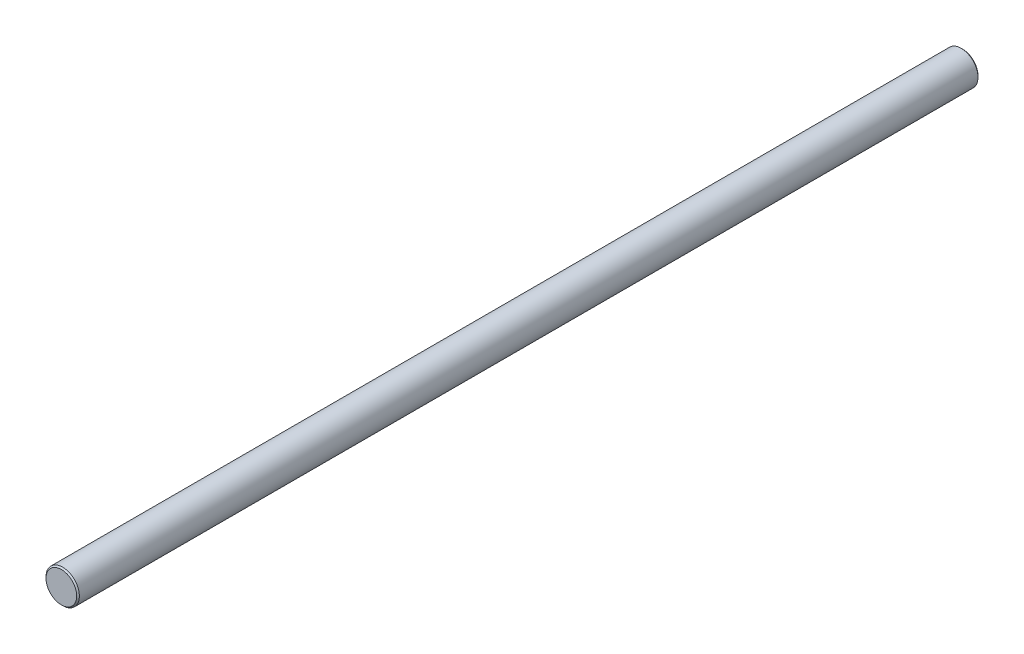
ISO-10303-21;
HEADER;
FILE_DESCRIPTION(('STEP AP214'),'2;1');
FILE_NAME('part.step','',(''),(''),'','','');
FILE_SCHEMA(('AUTOMOTIVE_DESIGN { 1 0 10303 214 1 1 1 1 }'));
ENDSEC;
DATA;
#1=APPLICATION_CONTEXT('core data for automotive mechanical design processes');
#2=APPLICATION_PROTOCOL_DEFINITION('international standard','automotive_design',2000,#1);
#3=PRODUCT_CONTEXT('',#1,'mechanical');
#4=PRODUCT('Part','Part','',(#3));
#5=PRODUCT_RELATED_PRODUCT_CATEGORY('part','',(#4));
#6=PRODUCT_DEFINITION_FORMATION('','',#4);
#7=PRODUCT_DEFINITION_CONTEXT('part definition',#1,'design');
#8=PRODUCT_DEFINITION('design','',#6,#7);
#9=PRODUCT_DEFINITION_SHAPE('','',#8);
#10=(LENGTH_UNIT() NAMED_UNIT(*) SI_UNIT(.MILLI.,.METRE.));
#11=(NAMED_UNIT(*) PLANE_ANGLE_UNIT() SI_UNIT($,.RADIAN.));
#12=(NAMED_UNIT(*) SI_UNIT($,.STERADIAN.) SOLID_ANGLE_UNIT());
#13=UNCERTAINTY_MEASURE_WITH_UNIT(LENGTH_MEASURE(1.E-05),#10,'distance_accuracy_value','');
#14=(GEOMETRIC_REPRESENTATION_CONTEXT(3) GLOBAL_UNCERTAINTY_ASSIGNED_CONTEXT((#13)) GLOBAL_UNIT_ASSIGNED_CONTEXT((#10,
#11,#12)) REPRESENTATION_CONTEXT('',''));
#15=CARTESIAN_POINT('',(0.,0.,0.));
#16=DIRECTION('',(0.,0.,1.));
#17=DIRECTION('',(1.,0.,0.));
#18=AXIS2_PLACEMENT_3D('',#15,#16,#17);
#19=CARTESIAN_POINT('',(0.,0.,81.));
#20=DIRECTION('',(0.,0.,-1.));
#21=DIRECTION('',(-1.,0.,0.));
#22=AXIS2_PLACEMENT_3D('',#19,#20,#21);
#23=CYLINDRICAL_SURFACE('',#22,1.5);
#24=CARTESIAN_POINT('',(0.,0.,80.88));
#25=DIRECTION('',(0.,0.,1.));
#26=DIRECTION('',(1.,0.,0.));
#27=AXIS2_PLACEMENT_3D('',#24,#25,#26);
#28=CIRCLE('',#27,1.5);
#29=CARTESIAN_POINT('',(-1.5,0.,80.88));
#30=VERTEX_POINT('',#29);
#31=EDGE_CURVE('E52',#30,#30,#28,.F.);
#32=ORIENTED_EDGE('',*,*,#31,.T.);
#33=EDGE_LOOP('',(#32));
#34=FACE_BOUND('',#33,.T.);
#35=CARTESIAN_POINT('',(0.,0.,0.120000000000003));
#36=DIRECTION('',(0.,0.,1.));
#37=DIRECTION('',(1.,0.,0.));
#38=AXIS2_PLACEMENT_3D('',#35,#36,#37);
#39=CIRCLE('',#38,1.5);
#40=CARTESIAN_POINT('',(1.5,0.,0.120000000000003));
#41=VERTEX_POINT('',#40);
#42=EDGE_CURVE('E56',#41,#41,#39,.T.);
#43=ORIENTED_EDGE('',*,*,#42,.T.);
#44=EDGE_LOOP('',(#43));
#45=FACE_BOUND('',#44,.T.);
#46=ADVANCED_FACE('F45',(#34,#45),#23,.T.);
#47=CARTESIAN_POINT('',(0.,0.,81.));
#48=DIRECTION('',(0.,0.,1.));
#49=DIRECTION('',(1.,0.,0.));
#50=AXIS2_PLACEMENT_3D('',#47,#48,#49);
#51=PLANE('',#50);
#52=CARTESIAN_POINT('',(0.,0.,81.));
#53=DIRECTION('',(0.,0.,1.));
#54=DIRECTION('',(1.,0.,0.));
#55=AXIS2_PLACEMENT_3D('',#52,#53,#54);
#56=CIRCLE('',#55,1.38000000000001);
#57=CARTESIAN_POINT('',(-1.38000000000001,0.,81.));
#58=VERTEX_POINT('',#57);
#59=EDGE_CURVE('E60',#58,#58,#56,.T.);
#60=ORIENTED_EDGE('',*,*,#59,.T.);
#61=EDGE_LOOP('',(#60));
#62=FACE_BOUND('',#61,.T.);
#63=ADVANCED_FACE('F66',(#62),#51,.T.);
#64=CARTESIAN_POINT('',(0.,0.,0.));
#65=DIRECTION('',(0.,0.,1.));
#66=DIRECTION('',(1.,0.,0.));
#67=AXIS2_PLACEMENT_3D('',#64,#65,#66);
#68=PLANE('',#67);
#69=CARTESIAN_POINT('',(0.,0.,0.));
#70=DIRECTION('',(0.,0.,1.));
#71=DIRECTION('',(1.,0.,0.));
#72=AXIS2_PLACEMENT_3D('',#69,#70,#71);
#73=CIRCLE('',#72,1.38000000000001);
#74=CARTESIAN_POINT('',(1.38000000000001,0.,0.));
#75=VERTEX_POINT('',#74);
#76=EDGE_CURVE('E10',#75,#75,#73,.F.);
#77=ORIENTED_EDGE('',*,*,#76,.T.);
#78=EDGE_LOOP('',(#77));
#79=FACE_BOUND('',#78,.T.);
#80=ADVANCED_FACE('F70',(#79),#68,.F.);
#81=CARTESIAN_POINT('',(0.,0.,81.));
#82=DIRECTION('',(0.,0.,-1.));
#83=DIRECTION('',(-1.,0.,0.));
#84=AXIS2_PLACEMENT_3D('',#81,#82,#83);
#85=CONICAL_SURFACE('',#84,1.38000000000001,0.785398163397478);
#86=CARTESIAN_POINT('',(-1.5,0.,80.88));
#87=CARTESIAN_POINT('',(-1.49875,0.,80.88125));
#88=CARTESIAN_POINT('',(-1.4975,0.,80.8825));
#89=CARTESIAN_POINT('',(-1.495,0.,80.885));
#90=CARTESIAN_POINT('',(-1.49375,0.,80.88625));
#91=CARTESIAN_POINT('',(-1.49125,0.,80.88875));
#92=CARTESIAN_POINT('',(-1.49,0.,80.89));
#93=CARTESIAN_POINT('',(-1.4875,0.,80.8925));
#94=CARTESIAN_POINT('',(-1.48625,0.,80.89375));
#95=CARTESIAN_POINT('',(-1.48375,0.,80.89625));
#96=CARTESIAN_POINT('',(-1.4825,0.,80.8975));
#97=CARTESIAN_POINT('',(-1.48,0.,80.9));
#98=CARTESIAN_POINT('',(-1.47875,0.,80.90125));
#99=CARTESIAN_POINT('',(-1.47625000000001,0.,80.90375));
#100=CARTESIAN_POINT('',(-1.475,0.,80.905));
#101=CARTESIAN_POINT('',(-1.4725,0.,80.9075));
#102=CARTESIAN_POINT('',(-1.47125,0.,80.90875));
#103=CARTESIAN_POINT('',(-1.46875,0.,80.91125));
#104=CARTESIAN_POINT('',(-1.46750000000001,0.,80.9125));
#105=CARTESIAN_POINT('',(-1.465,0.,80.915));
#106=CARTESIAN_POINT('',(-1.46375,0.,80.91625));
#107=CARTESIAN_POINT('',(-1.46125,0.,80.91875));
#108=CARTESIAN_POINT('',(-1.46000000000001,0.,80.92));
#109=CARTESIAN_POINT('',(-1.45750000000001,0.,80.9225));
#110=CARTESIAN_POINT('',(-1.45625000000001,0.,80.92375));
#111=CARTESIAN_POINT('',(-1.45375000000001,0.,80.92625));
#112=CARTESIAN_POINT('',(-1.45250000000001,0.,80.9275));
#113=CARTESIAN_POINT('',(-1.45000000000001,0.,80.93));
#114=CARTESIAN_POINT('',(-1.44875000000001,0.,80.93125));
#115=CARTESIAN_POINT('',(-1.44625000000001,0.,80.93375));
#116=CARTESIAN_POINT('',(-1.44500000000001,0.,80.935));
#117=CARTESIAN_POINT('',(-1.44250000000001,0.,80.9375));
#118=CARTESIAN_POINT('',(-1.44125000000001,0.,80.93875));
#119=CARTESIAN_POINT('',(-1.43875000000001,0.,80.94125));
#120=CARTESIAN_POINT('',(-1.43750000000001,0.,80.9425));
#121=CARTESIAN_POINT('',(-1.43500000000001,0.,80.945));
#122=CARTESIAN_POINT('',(-1.43375000000001,0.,80.94625));
#123=CARTESIAN_POINT('',(-1.43125000000001,0.,80.94875));
#124=CARTESIAN_POINT('',(-1.43000000000001,0.,80.95));
#125=CARTESIAN_POINT('',(-1.42750000000001,0.,80.9525));
#126=CARTESIAN_POINT('',(-1.42625000000001,0.,80.95375));
#127=CARTESIAN_POINT('',(-1.42375000000001,0.,80.95625));
#128=CARTESIAN_POINT('',(-1.42250000000001,0.,80.9575));
#129=CARTESIAN_POINT('',(-1.42000000000001,0.,80.96));
#130=CARTESIAN_POINT('',(-1.41875000000001,0.,80.96125));
#131=CARTESIAN_POINT('',(-1.41625000000001,0.,80.96375));
#132=CARTESIAN_POINT('',(-1.41500000000001,0.,80.965));
#133=CARTESIAN_POINT('',(-1.41250000000001,0.,80.9675));
#134=CARTESIAN_POINT('',(-1.41125000000001,0.,80.96875));
#135=CARTESIAN_POINT('',(-1.40875000000001,0.,80.97125));
#136=CARTESIAN_POINT('',(-1.40750000000001,0.,80.9725));
#137=CARTESIAN_POINT('',(-1.40500000000001,0.,80.975));
#138=CARTESIAN_POINT('',(-1.40375000000001,0.,80.97625));
#139=CARTESIAN_POINT('',(-1.40125000000001,0.,80.97875));
#140=CARTESIAN_POINT('',(-1.40000000000001,0.,80.98));
#141=CARTESIAN_POINT('',(-1.39750000000001,0.,80.9825));
#142=CARTESIAN_POINT('',(-1.39625000000001,0.,80.98375));
#143=CARTESIAN_POINT('',(-1.39375000000001,0.,80.98625));
#144=CARTESIAN_POINT('',(-1.39250000000001,0.,80.9875));
#145=CARTESIAN_POINT('',(-1.39000000000001,0.,80.99));
#146=CARTESIAN_POINT('',(-1.38875000000001,0.,80.99125));
#147=CARTESIAN_POINT('',(-1.38625000000001,0.,80.99375));
#148=CARTESIAN_POINT('',(-1.38500000000001,0.,80.995));
#149=CARTESIAN_POINT('',(-1.38250000000001,0.,80.9975));
#150=CARTESIAN_POINT('',(-1.38125000000001,0.,80.99875));
#151=CARTESIAN_POINT('',(-1.38000000000001,0.,81.));
#152=B_SPLINE_CURVE_WITH_KNOTS('',3,(#86,#87,#88,#89,#90,#91,#92,#93,#94,#95,#96,#97,#98,#99,
#100,#101,#102,#103,#104,#105,#106,#107,#108,#109,#110,#111,#112,#113,#114,#115,#116,#117,#118,
#119,#120,#121,#122,#123,#124,#125,#126,#127,#128,#129,#130,#131,#132,#133,#134,#135,#136,#137,
#138,#139,#140,#141,#142,#143,#144,#145,#146,#147,#148,#149,#150,#151),.UNSPECIFIED.,.F.,.F.,(4,
2,2,2,2,2,2,2,2,2,2,2,2,2,2,2,2,2,2,2,2,2,2,2,2,2,2,2,2,2,2,2,4),(0.,0.00530330085889659,
0.0106066017177932,0.0159099025766898,0.0212132034355864,0.026516504294483,0.0318198051533894,
0.0371231060122859,0.0424264068711825,0.0477297077300791,0.0530330085889757,0.0583363094478821,
0.0636396103067787,0.0689429111656753,0.0742462120245719,0.0795495128834685,0.0848528137423749,
0.0901561146012715,0.0954594154601681,0.100762716319065,0.106066017177961,0.111369318036858,
0.116672618895764,0.121975919754661,0.127279220613557,0.132582521472454,0.137885822331351,
0.143189123190257,0.148492424049154,0.15379572490805,0.159099025766947,0.164402326625843,
0.16970562748475),.UNSPECIFIED.);
#153=EDGE_CURVE('BSEAM68',#30,#58,#152,.T.);
#154=ORIENTED_EDGE('',*,*,#31,.F.);
#155=ORIENTED_EDGE('',*,*,#59,.F.);
#156=ORIENTED_EDGE('',*,*,#153,.T.);
#157=ORIENTED_EDGE('',*,*,#153,.F.);
#158=EDGE_LOOP('',(#154,#156,#155,#157));
#159=FACE_BOUND('',#158,.T.);
#160=ADVANCED_FACE('F68',(#159),#85,.T.);
#161=CARTESIAN_POINT('',(0.,0.,0.120000000000003));
#162=DIRECTION('',(0.,0.,1.));
#163=DIRECTION('',(1.,0.,0.));
#164=AXIS2_PLACEMENT_3D('',#161,#162,#163);
#165=CONICAL_SURFACE('',#164,1.5,0.785398163397408);
#166=ORIENTED_EDGE('',*,*,#76,.F.);
#167=EDGE_LOOP('',(#166));
#168=FACE_BOUND('',#167,.T.);
#169=ORIENTED_EDGE('',*,*,#42,.F.);
#170=EDGE_LOOP('',(#169));
#171=FACE_BOUND('',#170,.T.);
#172=ADVANCED_FACE('F47',(#168,#171),#165,.T.);
#173=CLOSED_SHELL('',(#46,#63,#80,#160,#172));
#174=MANIFOLD_SOLID_BREP('B2',#173);
#175=ADVANCED_BREP_SHAPE_REPRESENTATION('',(#18,#174),#14);
#176=SHAPE_DEFINITION_REPRESENTATION(#9,#175);
ENDSEC;
END-ISO-10303-21;
